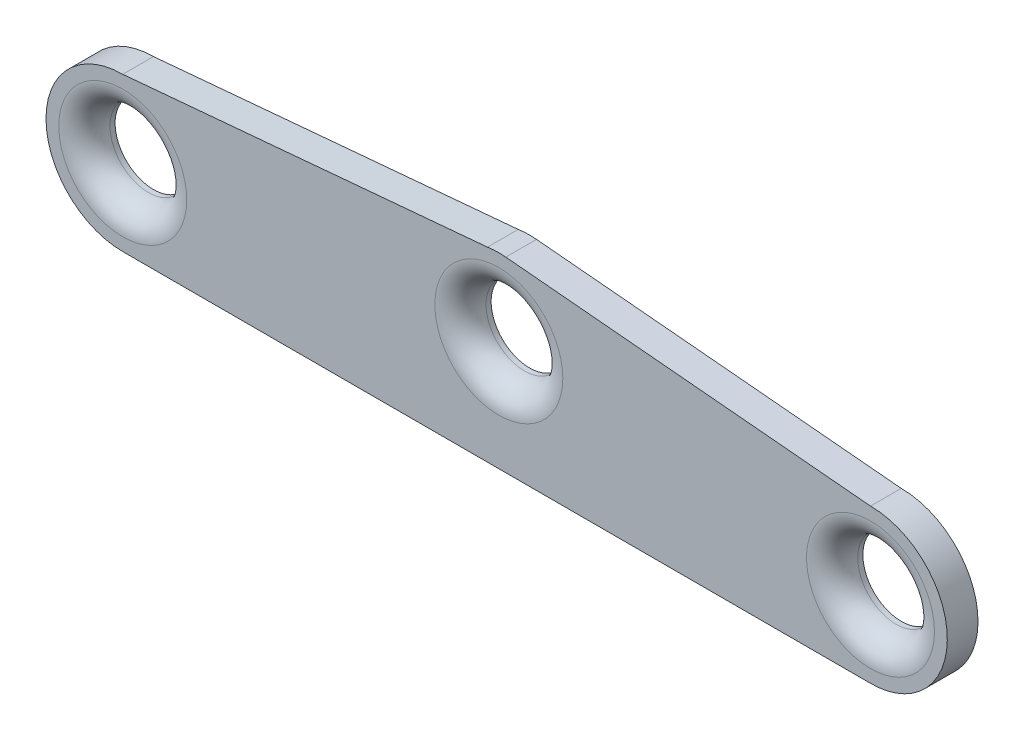
ISO-10303-21;
HEADER;
FILE_DESCRIPTION(('STEP AP214'),'2;1');
FILE_NAME('part.step','',(''),(''),'','','');
FILE_SCHEMA(('AUTOMOTIVE_DESIGN { 1 0 10303 214 1 1 1 1 }'));
ENDSEC;
DATA;
#1=APPLICATION_CONTEXT('core data for automotive mechanical design processes');
#2=APPLICATION_PROTOCOL_DEFINITION('international standard','automotive_design',2000,#1);
#3=PRODUCT_CONTEXT('',#1,'mechanical');
#4=PRODUCT('Part','Part','',(#3));
#5=PRODUCT_RELATED_PRODUCT_CATEGORY('part','',(#4));
#6=PRODUCT_DEFINITION_FORMATION('','',#4);
#7=PRODUCT_DEFINITION_CONTEXT('part definition',#1,'design');
#8=PRODUCT_DEFINITION('design','',#6,#7);
#9=PRODUCT_DEFINITION_SHAPE('','',#8);
#10=(LENGTH_UNIT() NAMED_UNIT(*) SI_UNIT(.MILLI.,.METRE.));
#11=(NAMED_UNIT(*) PLANE_ANGLE_UNIT() SI_UNIT($,.RADIAN.));
#12=(NAMED_UNIT(*) SI_UNIT($,.STERADIAN.) SOLID_ANGLE_UNIT());
#13=UNCERTAINTY_MEASURE_WITH_UNIT(LENGTH_MEASURE(1.E-05),#10,'distance_accuracy_value','');
#14=(GEOMETRIC_REPRESENTATION_CONTEXT(3) GLOBAL_UNCERTAINTY_ASSIGNED_CONTEXT((#13)) GLOBAL_UNIT_ASSIGNED_CONTEXT((#10,
#11,#12)) REPRESENTATION_CONTEXT('',''));
#15=CARTESIAN_POINT('',(0.,0.,0.));
#16=DIRECTION('',(0.,0.,1.));
#17=DIRECTION('',(1.,0.,0.));
#18=AXIS2_PLACEMENT_3D('',#15,#16,#17);
#19=CARTESIAN_POINT('',(-14.6094835617357,-0.654127433643359,1.2));
#20=DIRECTION('',(0.,0.,-1.));
#21=DIRECTION('',(-1.,0.,0.));
#22=AXIS2_PLACEMENT_3D('',#19,#20,#21);
#23=CYLINDRICAL_SURFACE('',#22,3.);
#24=DIRECTION('',(0.,0.,1.));
#25=VECTOR('',#24,1.);
#26=CARTESIAN_POINT('',(-14.6094835617357,2.34587256635664,0.));
#27=LINE('',#26,#25);
#28=CARTESIAN_POINT('',(-14.6094835617357,2.34587256635664,0.));
#29=VERTEX_POINT('',#28);
#30=CARTESIAN_POINT('',(-14.6094835617357,2.34587256635664,1.2));
#31=VERTEX_POINT('',#30);
#32=EDGE_CURVE('E59',#29,#31,#27,.T.);
#33=ORIENTED_EDGE('',*,*,#32,.F.);
#34=CARTESIAN_POINT('',(-14.6094835617357,-0.654127433643359,0.));
#35=DIRECTION('',(0.,0.,1.));
#36=DIRECTION('',(1.,0.,0.));
#37=AXIS2_PLACEMENT_3D('',#34,#35,#36);
#38=CIRCLE('',#37,3.);
#39=CARTESIAN_POINT('',(-14.5831152536141,-3.65401155012633,0.));
#40=VERTEX_POINT('',#39);
#41=EDGE_CURVE('E145',#29,#40,#38,.T.);
#42=ORIENTED_EDGE('',*,*,#41,.T.);
#43=DIRECTION('',(0.,0.,1.));
#44=VECTOR('',#43,1.);
#45=CARTESIAN_POINT('',(-14.5831152536141,-3.65401155012633,0.));
#46=LINE('',#45,#44);
#47=CARTESIAN_POINT('',(-14.5831152536141,-3.65401155012633,1.2));
#48=VERTEX_POINT('',#47);
#49=EDGE_CURVE('E138',#40,#48,#46,.T.);
#50=ORIENTED_EDGE('',*,*,#49,.T.);
#51=CARTESIAN_POINT('',(-14.6094835617357,-0.654127433643359,1.2));
#52=DIRECTION('',(0.,0.,1.));
#53=DIRECTION('',(1.,0.,0.));
#54=AXIS2_PLACEMENT_3D('',#51,#52,#53);
#55=CIRCLE('',#54,3.);
#56=EDGE_CURVE('E146',#31,#48,#55,.T.);
#57=ORIENTED_EDGE('',*,*,#56,.F.);
#58=EDGE_LOOP('',(#33,#42,#50,#57));
#59=FACE_BOUND('',#58,.T.);
#60=ADVANCED_FACE('F43',(#59),#23,.T.);
#61=CARTESIAN_POINT('',(-14.6094835617357,-0.654127433643359,1.2));
#62=DIRECTION('',(0.,0.,1.));
#63=DIRECTION('',(1.,0.,0.));
#64=AXIS2_PLACEMENT_3D('',#61,#62,#63);
#65=PLANE('',#64);
#66=CARTESIAN_POINT('',(14.6094835617357,-0.656172202978543,1.2));
#67=DIRECTION('',(0.,0.,1.));
#68=DIRECTION('',(1.,0.,0.));
#69=AXIS2_PLACEMENT_3D('',#66,#67,#68);
#70=CIRCLE('',#69,2.5);
#71=CARTESIAN_POINT('',(17.1094835617357,-0.656172202978543,1.2));
#72=VERTEX_POINT('',#71);
#73=EDGE_CURVE('E164',#72,#72,#70,.F.);
#74=ORIENTED_EDGE('',*,*,#73,.T.);
#75=EDGE_LOOP('',(#74));
#76=FACE_BOUND('',#75,.T.);
#77=CARTESIAN_POINT('',(0.0851034467720514,0.656172202978572,1.2));
#78=DIRECTION('',(0.,0.,1.));
#79=DIRECTION('',(1.,0.,0.));
#80=AXIS2_PLACEMENT_3D('',#77,#78,#79);
#81=CIRCLE('',#80,2.5);
#82=CARTESIAN_POINT('',(2.58510344677205,0.656172202978572,1.2));
#83=VERTEX_POINT('',#82);
#84=EDGE_CURVE('E160',#83,#83,#81,.F.);
#85=ORIENTED_EDGE('',*,*,#84,.T.);
#86=EDGE_LOOP('',(#85));
#87=FACE_BOUND('',#86,.T.);
#88=CARTESIAN_POINT('',(-14.6094835617357,-0.654127433643359,1.2));
#89=DIRECTION('',(0.,0.,1.));
#90=DIRECTION('',(1.,0.,0.));
#91=AXIS2_PLACEMENT_3D('',#88,#89,#90);
#92=CIRCLE('',#91,2.5);
#93=CARTESIAN_POINT('',(-12.1094835617357,-0.654127433643359,1.2));
#94=VERTEX_POINT('',#93);
#95=EDGE_CURVE('E156',#94,#94,#92,.F.);
#96=ORIENTED_EDGE('',*,*,#95,.T.);
#97=EDGE_LOOP('',(#96));
#98=FACE_BOUND('',#97,.T.);
#99=ORIENTED_EDGE('',*,*,#56,.T.);
#100=DIRECTION('',(0.9999999995513,-2.99566195353485E-05,0.));
#101=VECTOR('',#100,1.);
#102=CARTESIAN_POINT('',(-0.000109474920609621,-3.65444840768232,1.2));
#103=LINE('',#102,#101);
#104=CARTESIAN_POINT('',(14.5215575103222,-3.65488342773541,1.2));
#105=VERTEX_POINT('',#104);
#106=EDGE_CURVE('E116',#48,#105,#103,.T.);
#107=ORIENTED_EDGE('',*,*,#106,.T.);
#108=CARTESIAN_POINT('',(14.6094835617357,-0.656172202978543,1.2));
#109=DIRECTION('',(0.,0.,1.));
#110=DIRECTION('',(1.,0.,0.));
#111=AXIS2_PLACEMENT_3D('',#108,#109,#110);
#112=CIRCLE('',#111,3.);
#113=CARTESIAN_POINT('',(14.6094835617357,2.34382779702146,1.2));
#114=VERTEX_POINT('',#113);
#115=EDGE_CURVE('E113',#105,#114,#112,.T.);
#116=ORIENTED_EDGE('',*,*,#115,.T.);
#117=DIRECTION('',(-0.995865995671846,0.0908345675639189,0.));
#118=VECTOR('',#117,1.);
#119=CARTESIAN_POINT('',(0.332562113047999,3.64604917175642,1.2));
#120=LINE('',#119,#118);
#121=CARTESIAN_POINT('',(0.357606659446686,3.64376481768484,1.2));
#122=VERTEX_POINT('',#121);
#123=EDGE_CURVE('E103',#114,#122,#120,.T.);
#124=ORIENTED_EDGE('',*,*,#123,.T.);
#125=CARTESIAN_POINT('',(0.0851034467720514,0.656172202978572,1.2));
#126=DIRECTION('',(0.,0.,1.));
#127=DIRECTION('',(1.,0.,0.));
#128=AXIS2_PLACEMENT_3D('',#125,#126,#127);
#129=CIRCLE('',#128,3.);
#130=CARTESIAN_POINT('',(-0.357791461930925,3.62329944997102,1.2));
#131=VERTEX_POINT('',#130);
#132=EDGE_CURVE('E82',#122,#131,#129,.T.);
#133=ORIENTED_EDGE('',*,*,#132,.T.);
#134=DIRECTION('',(0.996006975759128,0.0892754402910228,0.));
#135=VECTOR('',#134,1.);
#136=CARTESIAN_POINT('',(-0.325031658795385,3.62623582081977,1.2));
#137=LINE('',#136,#135);
#138=EDGE_CURVE('E115',#31,#131,#137,.T.);
#139=ORIENTED_EDGE('',*,*,#138,.F.);
#140=EDGE_LOOP('',(#99,#107,#116,#124,#133,#139));
#141=FACE_BOUND('',#140,.T.);
#142=ADVANCED_FACE('F111',(#76,#87,#98,#141),#65,.T.);
#143=CARTESIAN_POINT('',(-14.6094835617357,-0.654127433643359,0.));
#144=DIRECTION('',(0.,0.,1.));
#145=DIRECTION('',(1.,0.,0.));
#146=AXIS2_PLACEMENT_3D('',#143,#144,#145);
#147=PLANE('',#146);
#148=ORIENTED_EDGE('',*,*,#41,.F.);
#149=DIRECTION('',(0.996006975759128,0.0892754402910228,0.));
#150=VECTOR('',#149,1.);
#151=CARTESIAN_POINT('',(-0.325031658795385,3.62623582081977,0.));
#152=LINE('',#151,#150);
#153=CARTESIAN_POINT('',(-0.357791461930925,3.62329944997102,0.));
#154=VERTEX_POINT('',#153);
#155=EDGE_CURVE('E65',#29,#154,#152,.T.);
#156=ORIENTED_EDGE('',*,*,#155,.T.);
#157=CARTESIAN_POINT('',(0.0851034467720514,0.656172202978572,0.));
#158=DIRECTION('',(0.,0.,1.));
#159=DIRECTION('',(1.,0.,0.));
#160=AXIS2_PLACEMENT_3D('',#157,#158,#159);
#161=CIRCLE('',#160,3.);
#162=CARTESIAN_POINT('',(0.357607149463808,3.64377018999411,0.));
#163=VERTEX_POINT('',#162);
#164=EDGE_CURVE('E94',#163,#154,#161,.T.);
#165=ORIENTED_EDGE('',*,*,#164,.F.);
#166=DIRECTION('',(-0.995865995671846,0.0908345675639189,0.));
#167=VECTOR('',#166,1.);
#168=CARTESIAN_POINT('',(0.332562113047999,3.64604917175642,0.));
#169=LINE('',#168,#167);
#170=CARTESIAN_POINT('',(14.6094835617357,2.34382779702146,0.));
#171=VERTEX_POINT('',#170);
#172=EDGE_CURVE('E105',#171,#163,#169,.T.);
#173=ORIENTED_EDGE('',*,*,#172,.F.);
#174=CARTESIAN_POINT('',(14.6094835617357,-0.656172202978543,0.));
#175=DIRECTION('',(0.,0.,1.));
#176=DIRECTION('',(1.,0.,0.));
#177=AXIS2_PLACEMENT_3D('',#174,#175,#176);
#178=CIRCLE('',#177,3.);
#179=CARTESIAN_POINT('',(14.5215575103222,-3.65488342773541,0.));
#180=VERTEX_POINT('',#179);
#181=EDGE_CURVE('E229',#180,#171,#178,.T.);
#182=ORIENTED_EDGE('',*,*,#181,.F.);
#183=DIRECTION('',(0.9999999995513,-2.99566195353485E-05,0.));
#184=VECTOR('',#183,1.);
#185=CARTESIAN_POINT('',(-0.000109474920609621,-3.65444840768232,0.));
#186=LINE('',#185,#184);
#187=EDGE_CURVE('E120',#40,#180,#186,.T.);
#188=ORIENTED_EDGE('',*,*,#187,.F.);
#189=EDGE_LOOP('',(#148,#156,#165,#173,#182,#188));
#190=FACE_BOUND('',#189,.T.);
#191=CARTESIAN_POINT('',(-14.6094835617357,-0.654127433643359,0.));
#192=DIRECTION('',(0.,0.,1.));
#193=DIRECTION('',(1.,0.,0.));
#194=AXIS2_PLACEMENT_3D('',#191,#192,#193);
#195=CIRCLE('',#194,1.5);
#196=CARTESIAN_POINT('',(-13.1094835617357,-0.654127433643359,0.));
#197=VERTEX_POINT('',#196);
#198=EDGE_CURVE('E128',#197,#197,#195,.T.);
#199=ORIENTED_EDGE('',*,*,#198,.T.);
#200=EDGE_LOOP('',(#199));
#201=FACE_BOUND('',#200,.T.);
#202=CARTESIAN_POINT('',(0.0851034467720514,0.656172202978572,0.));
#203=DIRECTION('',(0.,0.,1.));
#204=DIRECTION('',(1.,0.,0.));
#205=AXIS2_PLACEMENT_3D('',#202,#203,#204);
#206=CIRCLE('',#205,1.5);
#207=CARTESIAN_POINT('',(1.58510344677205,0.656172202978572,0.));
#208=VERTEX_POINT('',#207);
#209=EDGE_CURVE('E122',#208,#208,#206,.T.);
#210=ORIENTED_EDGE('',*,*,#209,.T.);
#211=EDGE_LOOP('',(#210));
#212=FACE_BOUND('',#211,.T.);
#213=CARTESIAN_POINT('',(14.6094835617357,-0.656172202978543,0.));
#214=DIRECTION('',(0.,0.,1.));
#215=DIRECTION('',(1.,0.,0.));
#216=AXIS2_PLACEMENT_3D('',#213,#214,#215);
#217=CIRCLE('',#216,1.5);
#218=CARTESIAN_POINT('',(16.1094835617357,-0.656172202978543,0.));
#219=VERTEX_POINT('',#218);
#220=EDGE_CURVE('E95',#219,#219,#217,.T.);
#221=ORIENTED_EDGE('',*,*,#220,.T.);
#222=EDGE_LOOP('',(#221));
#223=FACE_BOUND('',#222,.T.);
#224=ADVANCED_FACE('F193',(#190,#201,#212,#223),#147,.F.);
#225=CARTESIAN_POINT('',(-14.6094835617357,-0.654127433643359,1.2));
#226=DIRECTION('',(0.,0.,-1.));
#227=DIRECTION('',(-1.,0.,0.));
#228=AXIS2_PLACEMENT_3D('',#225,#226,#227);
#229=CYLINDRICAL_SURFACE('',#228,1.5);
#230=CARTESIAN_POINT('',(-14.6094835617357,-0.654127433643359,0.2));
#231=DIRECTION('',(0.,0.,1.));
#232=DIRECTION('',(1.,0.,0.));
#233=AXIS2_PLACEMENT_3D('',#230,#231,#232);
#234=CIRCLE('',#233,1.5);
#235=CARTESIAN_POINT('',(-13.1094835617357,-0.654127433643359,0.2));
#236=VERTEX_POINT('',#235);
#237=EDGE_CURVE('E11',#236,#236,#234,.T.);
#238=ORIENTED_EDGE('',*,*,#237,.T.);
#239=EDGE_LOOP('',(#238));
#240=FACE_BOUND('',#239,.T.);
#241=ORIENTED_EDGE('',*,*,#198,.F.);
#242=EDGE_LOOP('',(#241));
#243=FACE_BOUND('',#242,.T.);
#244=ADVANCED_FACE('F198',(#240,#243),#229,.F.);
#245=CARTESIAN_POINT('',(-0.325031658795385,3.62623582081977,0.));
#246=DIRECTION('',(0.0892754402910228,-0.996006975759128,0.));
#247=DIRECTION('',(0.996006975759128,0.0892754402910228,0.));
#248=AXIS2_PLACEMENT_3D('',#245,#246,#247);
#249=PLANE('',#248);
#250=ORIENTED_EDGE('',*,*,#138,.T.);
#251=DIRECTION('',(0.,0.,1.));
#252=VECTOR('',#251,1.);
#253=CARTESIAN_POINT('',(-0.357791461930925,3.62329944997102,0.));
#254=LINE('',#253,#252);
#255=EDGE_CURVE('E90',#154,#131,#254,.T.);
#256=ORIENTED_EDGE('',*,*,#255,.F.);
#257=ORIENTED_EDGE('',*,*,#155,.F.);
#258=ORIENTED_EDGE('',*,*,#32,.T.);
#259=EDGE_LOOP('',(#250,#256,#257,#258));
#260=FACE_BOUND('',#259,.T.);
#261=ADVANCED_FACE('F203',(#260),#249,.F.);
#262=CARTESIAN_POINT('',(0.332562113047999,3.64604917175642,0.));
#263=DIRECTION('',(0.0908345675639189,0.995865995671845,0.));
#264=DIRECTION('',(-0.995865995671846,0.0908345675639189,0.));
#265=AXIS2_PLACEMENT_3D('',#262,#263,#264);
#266=PLANE('',#265);
#267=ORIENTED_EDGE('',*,*,#123,.F.);
#268=DIRECTION('',(0.,0.,1.));
#269=VECTOR('',#268,1.);
#270=CARTESIAN_POINT('',(14.6094835617357,2.34382779702146,0.));
#271=LINE('',#270,#269);
#272=EDGE_CURVE('E107',#171,#114,#271,.T.);
#273=ORIENTED_EDGE('',*,*,#272,.F.);
#274=ORIENTED_EDGE('',*,*,#172,.T.);
#275=DIRECTION('',(0.,0.,1.));
#276=VECTOR('',#275,1.);
#277=CARTESIAN_POINT('',(0.357606659446686,3.64376481768484,0.));
#278=LINE('',#277,#276);
#279=EDGE_CURVE('E87',#163,#122,#278,.T.);
#280=ORIENTED_EDGE('',*,*,#279,.T.);
#281=EDGE_LOOP('',(#267,#273,#274,#280));
#282=FACE_BOUND('',#281,.T.);
#283=ADVANCED_FACE('F100',(#282),#266,.T.);
#284=CARTESIAN_POINT('',(-0.000109474920609621,-3.65444840768232,0.));
#285=DIRECTION('',(-2.99566195353485E-05,-0.9999999995513,0.));
#286=DIRECTION('',(0.999999999551301,-2.99566195353485E-05,0.));
#287=AXIS2_PLACEMENT_3D('',#284,#285,#286);
#288=PLANE('',#287);
#289=ORIENTED_EDGE('',*,*,#106,.F.);
#290=ORIENTED_EDGE('',*,*,#49,.F.);
#291=ORIENTED_EDGE('',*,*,#187,.T.);
#292=DIRECTION('',(0.,0.,1.));
#293=VECTOR('',#292,1.);
#294=CARTESIAN_POINT('',(14.5215575103222,-3.65488342773541,0.));
#295=LINE('',#294,#293);
#296=EDGE_CURVE('E134',#180,#105,#295,.T.);
#297=ORIENTED_EDGE('',*,*,#296,.T.);
#298=EDGE_LOOP('',(#289,#290,#291,#297));
#299=FACE_BOUND('',#298,.T.);
#300=ADVANCED_FACE('F205',(#299),#288,.T.);
#301=CARTESIAN_POINT('',(0.0851034467720514,0.656172202978572,1.2));
#302=DIRECTION('',(0.,0.,-1.));
#303=DIRECTION('',(-1.,0.,0.));
#304=AXIS2_PLACEMENT_3D('',#301,#302,#303);
#305=CYLINDRICAL_SURFACE('',#304,3.);
#306=ORIENTED_EDGE('',*,*,#164,.T.);
#307=ORIENTED_EDGE('',*,*,#255,.T.);
#308=ORIENTED_EDGE('',*,*,#132,.F.);
#309=ORIENTED_EDGE('',*,*,#279,.F.);
#310=EDGE_LOOP('',(#306,#307,#308,#309));
#311=FACE_BOUND('',#310,.T.);
#312=ADVANCED_FACE('F85',(#311),#305,.T.);
#313=CARTESIAN_POINT('',(0.0851034467720514,0.656172202978572,1.2));
#314=DIRECTION('',(0.,0.,-1.));
#315=DIRECTION('',(-1.,0.,0.));
#316=AXIS2_PLACEMENT_3D('',#313,#314,#315);
#317=CYLINDRICAL_SURFACE('',#316,1.5);
#318=CARTESIAN_POINT('',(0.0851034467720514,0.656172202978572,0.2));
#319=DIRECTION('',(0.,0.,1.));
#320=DIRECTION('',(1.,0.,0.));
#321=AXIS2_PLACEMENT_3D('',#318,#319,#320);
#322=CIRCLE('',#321,1.5);
#323=CARTESIAN_POINT('',(1.58510344677205,0.656172202978572,0.2));
#324=VERTEX_POINT('',#323);
#325=EDGE_CURVE('E52',#324,#324,#322,.T.);
#326=ORIENTED_EDGE('',*,*,#325,.T.);
#327=EDGE_LOOP('',(#326));
#328=FACE_BOUND('',#327,.T.);
#329=ORIENTED_EDGE('',*,*,#209,.F.);
#330=EDGE_LOOP('',(#329));
#331=FACE_BOUND('',#330,.T.);
#332=ADVANCED_FACE('F171',(#328,#331),#317,.F.);
#333=CARTESIAN_POINT('',(14.6094835617357,-0.656172202978543,1.2));
#334=DIRECTION('',(0.,0.,-1.));
#335=DIRECTION('',(-1.,0.,0.));
#336=AXIS2_PLACEMENT_3D('',#333,#334,#335);
#337=CYLINDRICAL_SURFACE('',#336,3.);
#338=ORIENTED_EDGE('',*,*,#272,.T.);
#339=ORIENTED_EDGE('',*,*,#115,.F.);
#340=ORIENTED_EDGE('',*,*,#296,.F.);
#341=ORIENTED_EDGE('',*,*,#181,.T.);
#342=EDGE_LOOP('',(#338,#339,#340,#341));
#343=FACE_BOUND('',#342,.T.);
#344=ADVANCED_FACE('F215',(#343),#337,.T.);
#345=CARTESIAN_POINT('',(14.6094835617357,-0.656172202978543,1.2));
#346=DIRECTION('',(0.,0.,-1.));
#347=DIRECTION('',(-1.,0.,0.));
#348=AXIS2_PLACEMENT_3D('',#345,#346,#347);
#349=CYLINDRICAL_SURFACE('',#348,1.5);
#350=CARTESIAN_POINT('',(14.6094835617357,-0.656172202978543,0.2));
#351=DIRECTION('',(0.,0.,1.));
#352=DIRECTION('',(1.,0.,0.));
#353=AXIS2_PLACEMENT_3D('',#350,#351,#352);
#354=CIRCLE('',#353,1.5);
#355=CARTESIAN_POINT('',(16.1094835617357,-0.656172202978543,0.2));
#356=VERTEX_POINT('',#355);
#357=EDGE_CURVE('E149',#356,#356,#354,.T.);
#358=ORIENTED_EDGE('',*,*,#357,.T.);
#359=EDGE_LOOP('',(#358));
#360=FACE_BOUND('',#359,.T.);
#361=ORIENTED_EDGE('',*,*,#220,.F.);
#362=EDGE_LOOP('',(#361));
#363=FACE_BOUND('',#362,.T.);
#364=ADVANCED_FACE('F183',(#360,#363),#349,.F.);
#365=CARTESIAN_POINT('',(14.6094835617357,-0.656172202978543,0.2));
#366=DIRECTION('',(0.,0.,1.));
#367=DIRECTION('',(1.,0.,0.));
#368=AXIS2_PLACEMENT_3D('',#365,#366,#367);
#369=TOROIDAL_SURFACE('',#368,2.5,1.);
#370=ORIENTED_EDGE('',*,*,#73,.F.);
#371=EDGE_LOOP('',(#370));
#372=FACE_BOUND('',#371,.T.);
#373=ORIENTED_EDGE('',*,*,#357,.F.);
#374=EDGE_LOOP('',(#373));
#375=FACE_BOUND('',#374,.T.);
#376=ADVANCED_FACE('F176',(#372,#375),#369,.T.);
#377=CARTESIAN_POINT('',(0.0851034467720514,0.656172202978572,0.2));
#378=DIRECTION('',(0.,0.,1.));
#379=DIRECTION('',(1.,0.,0.));
#380=AXIS2_PLACEMENT_3D('',#377,#378,#379);
#381=TOROIDAL_SURFACE('',#380,2.5,1.);
#382=ORIENTED_EDGE('',*,*,#84,.F.);
#383=EDGE_LOOP('',(#382));
#384=FACE_BOUND('',#383,.T.);
#385=ORIENTED_EDGE('',*,*,#325,.F.);
#386=EDGE_LOOP('',(#385));
#387=FACE_BOUND('',#386,.T.);
#388=ADVANCED_FACE('F174',(#384,#387),#381,.T.);
#389=CARTESIAN_POINT('',(-14.6094835617357,-0.654127433643359,0.2));
#390=DIRECTION('',(0.,0.,1.));
#391=DIRECTION('',(1.,0.,0.));
#392=AXIS2_PLACEMENT_3D('',#389,#390,#391);
#393=TOROIDAL_SURFACE('',#392,2.5,1.);
#394=ORIENTED_EDGE('',*,*,#95,.F.);
#395=EDGE_LOOP('',(#394));
#396=FACE_BOUND('',#395,.T.);
#397=ORIENTED_EDGE('',*,*,#237,.F.);
#398=EDGE_LOOP('',(#397));
#399=FACE_BOUND('',#398,.T.);
#400=ADVANCED_FACE('F45',(#396,#399),#393,.T.);
#401=CLOSED_SHELL('',(#60,#142,#224,#244,#261,#283,#300,#312,#332,#344,#364,#376,#388,#400));
#402=MANIFOLD_SOLID_BREP('B2',#401);
#403=ADVANCED_BREP_SHAPE_REPRESENTATION('',(#18,#402),#14);
#404=SHAPE_DEFINITION_REPRESENTATION(#9,#403);
ENDSEC;
END-ISO-10303-21;
